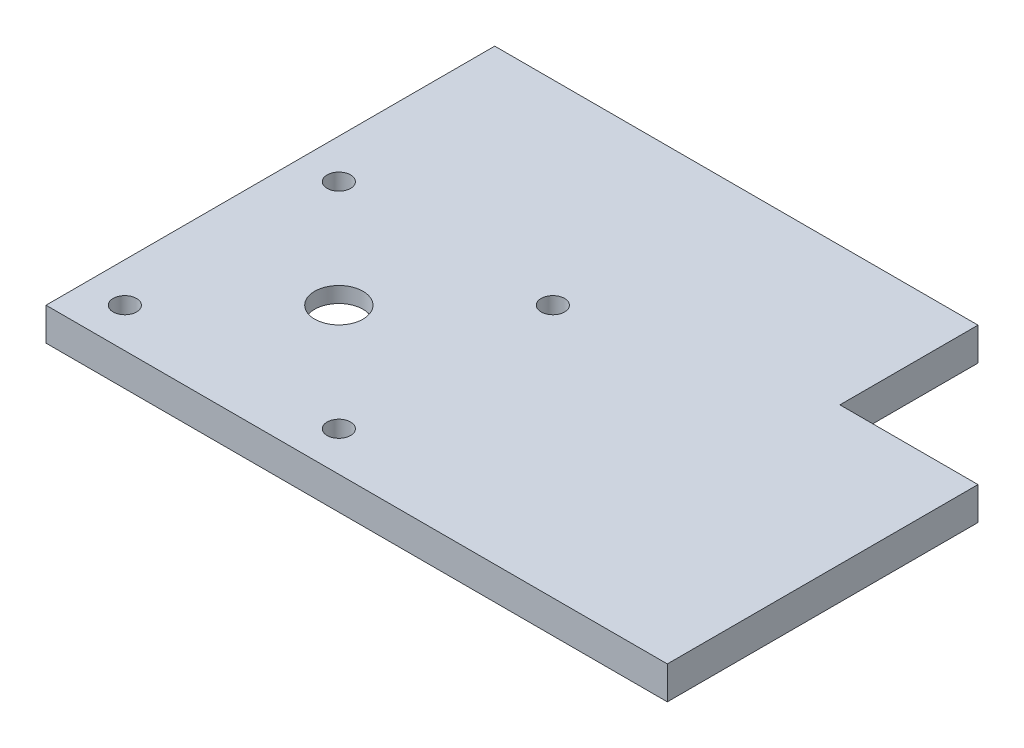
ISO-10303-21;
HEADER;
FILE_DESCRIPTION(('STEP AP214'),'2;1');
FILE_NAME('part.step','',(''),(''),'','','');
FILE_SCHEMA(('AUTOMOTIVE_DESIGN { 1 0 10303 214 1 1 1 1 }'));
ENDSEC;
DATA;
#1=APPLICATION_CONTEXT('core data for automotive mechanical design processes');
#2=APPLICATION_PROTOCOL_DEFINITION('international standard','automotive_design',2000,#1);
#3=PRODUCT_CONTEXT('',#1,'mechanical');
#4=PRODUCT('Part','Part','',(#3));
#5=PRODUCT_RELATED_PRODUCT_CATEGORY('part','',(#4));
#6=PRODUCT_DEFINITION_FORMATION('','',#4);
#7=PRODUCT_DEFINITION_CONTEXT('part definition',#1,'design');
#8=PRODUCT_DEFINITION('design','',#6,#7);
#9=PRODUCT_DEFINITION_SHAPE('','',#8);
#10=(LENGTH_UNIT() NAMED_UNIT(*) SI_UNIT(.MILLI.,.METRE.));
#11=(NAMED_UNIT(*) PLANE_ANGLE_UNIT() SI_UNIT($,.RADIAN.));
#12=(NAMED_UNIT(*) SI_UNIT($,.STERADIAN.) SOLID_ANGLE_UNIT());
#13=UNCERTAINTY_MEASURE_WITH_UNIT(LENGTH_MEASURE(1.E-05),#10,'distance_accuracy_value','');
#14=(GEOMETRIC_REPRESENTATION_CONTEXT(3) GLOBAL_UNCERTAINTY_ASSIGNED_CONTEXT((#13)) GLOBAL_UNIT_ASSIGNED_CONTEXT((#10,
#11,#12)) REPRESENTATION_CONTEXT('',''));
#15=CARTESIAN_POINT('',(0.,0.,0.));
#16=DIRECTION('',(0.,0.,1.));
#17=DIRECTION('',(1.,0.,0.));
#18=AXIS2_PLACEMENT_3D('',#15,#16,#17);
#19=CARTESIAN_POINT('',(21.209,0.,-21.209));
#20=DIRECTION('',(0.,-1.,0.));
#21=DIRECTION('',(0.,0.,-1.));
#22=AXIS2_PLACEMENT_3D('',#19,#20,#21);
#23=CYLINDRICAL_SURFACE('',#22,3.49999999999999);
#24=CARTESIAN_POINT('',(21.209,4.7625,-21.209));
#25=DIRECTION('',(0.,-1.,0.));
#26=DIRECTION('',(0.,0.,-1.));
#27=AXIS2_PLACEMENT_3D('',#24,#25,#26);
#28=CIRCLE('',#27,3.5);
#29=CARTESIAN_POINT('',(21.209,4.7625,-24.709));
#30=VERTEX_POINT('',#29);
#31=EDGE_CURVE('E226',#30,#30,#28,.T.);
#32=ORIENTED_EDGE('',*,*,#31,.F.);
#33=EDGE_LOOP('',(#32));
#34=FACE_BOUND('',#33,.T.);
#35=CARTESIAN_POINT('',(21.209,2.5,-21.209));
#36=DIRECTION('',(0.,-1.,0.));
#37=DIRECTION('',(0.,0.,-1.));
#38=AXIS2_PLACEMENT_3D('',#35,#36,#37);
#39=CIRCLE('',#38,3.49999999999999);
#40=CARTESIAN_POINT('',(21.209,2.5,-24.709));
#41=VERTEX_POINT('',#40);
#42=EDGE_CURVE('E38',#41,#41,#39,.F.);
#43=ORIENTED_EDGE('',*,*,#42,.F.);
#44=EDGE_LOOP('',(#43));
#45=FACE_BOUND('',#44,.T.);
#46=ADVANCED_FACE('F34',(#34,#45),#23,.F.);
#47=CARTESIAN_POINT('',(0.,4.7625,0.));
#48=DIRECTION('',(1.,0.,0.));
#49=DIRECTION('',(0.,0.,-1.));
#50=AXIS2_PLACEMENT_3D('',#47,#48,#49);
#51=PLANE('',#50);
#52=DIRECTION('',(0.,0.,1.));
#53=VECTOR('',#52,1.);
#54=CARTESIAN_POINT('',(0.,0.,0.));
#55=LINE('',#54,#53);
#56=CARTESIAN_POINT('',(0.,0.,-65.));
#57=VERTEX_POINT('',#56);
#58=CARTESIAN_POINT('',(0.,0.,0.));
#59=VERTEX_POINT('',#58);
#60=EDGE_CURVE('E120',#57,#59,#55,.T.);
#61=ORIENTED_EDGE('',*,*,#60,.T.);
#62=DIRECTION('',(0.,-1.,0.));
#63=VECTOR('',#62,1.);
#64=CARTESIAN_POINT('',(0.,4.7625,0.));
#65=LINE('',#64,#63);
#66=CARTESIAN_POINT('',(0.,4.7625,0.));
#67=VERTEX_POINT('',#66);
#68=EDGE_CURVE('E11',#67,#59,#65,.T.);
#69=ORIENTED_EDGE('',*,*,#68,.F.);
#70=DIRECTION('',(0.,0.,1.));
#71=VECTOR('',#70,1.);
#72=CARTESIAN_POINT('',(0.,4.7625,0.));
#73=LINE('',#72,#71);
#74=CARTESIAN_POINT('',(0.,4.7625,-65.));
#75=VERTEX_POINT('',#74);
#76=EDGE_CURVE('E131',#75,#67,#73,.T.);
#77=ORIENTED_EDGE('',*,*,#76,.F.);
#78=DIRECTION('',(0.,-1.,0.));
#79=VECTOR('',#78,1.);
#80=CARTESIAN_POINT('',(0.,4.7625,-65.));
#81=LINE('',#80,#79);
#82=EDGE_CURVE('E116',#75,#57,#81,.T.);
#83=ORIENTED_EDGE('',*,*,#82,.T.);
#84=EDGE_LOOP('',(#61,#69,#77,#83));
#85=FACE_BOUND('',#84,.T.);
#86=ADVANCED_FACE('F36',(#85),#51,.F.);
#87=CARTESIAN_POINT('',(0.,4.7625,0.));
#88=DIRECTION('',(0.,0.,-1.));
#89=DIRECTION('',(-1.,0.,0.));
#90=AXIS2_PLACEMENT_3D('',#87,#88,#89);
#91=PLANE('',#90);
#92=DIRECTION('',(1.,0.,0.));
#93=VECTOR('',#92,1.);
#94=CARTESIAN_POINT('',(0.,0.,0.));
#95=LINE('',#94,#93);
#96=CARTESIAN_POINT('',(90.,0.,0.));
#97=VERTEX_POINT('',#96);
#98=EDGE_CURVE('E123',#59,#97,#95,.T.);
#99=ORIENTED_EDGE('',*,*,#98,.T.);
#100=DIRECTION('',(0.,-1.,0.));
#101=VECTOR('',#100,1.);
#102=CARTESIAN_POINT('',(90.,4.7625,0.));
#103=LINE('',#102,#101);
#104=CARTESIAN_POINT('',(90.,4.7625,0.));
#105=VERTEX_POINT('',#104);
#106=EDGE_CURVE('E44',#105,#97,#103,.T.);
#107=ORIENTED_EDGE('',*,*,#106,.F.);
#108=DIRECTION('',(1.,0.,0.));
#109=VECTOR('',#108,1.);
#110=CARTESIAN_POINT('',(0.,4.7625,0.));
#111=LINE('',#110,#109);
#112=EDGE_CURVE('E89',#67,#105,#111,.T.);
#113=ORIENTED_EDGE('',*,*,#112,.F.);
#114=ORIENTED_EDGE('',*,*,#68,.T.);
#115=EDGE_LOOP('',(#99,#107,#113,#114));
#116=FACE_BOUND('',#115,.T.);
#117=ADVANCED_FACE('F162',(#116),#91,.F.);
#118=CARTESIAN_POINT('',(90.,4.7625,0.));
#119=DIRECTION('',(-1.,0.,0.));
#120=DIRECTION('',(0.,0.,1.));
#121=AXIS2_PLACEMENT_3D('',#118,#119,#120);
#122=PLANE('',#121);
#123=DIRECTION('',(0.,0.,-1.));
#124=VECTOR('',#123,1.);
#125=CARTESIAN_POINT('',(90.,0.,0.));
#126=LINE('',#125,#124);
#127=CARTESIAN_POINT('',(90.,0.,-45.));
#128=VERTEX_POINT('',#127);
#129=EDGE_CURVE('E126',#97,#128,#126,.T.);
#130=ORIENTED_EDGE('',*,*,#129,.T.);
#131=DIRECTION('',(0.,-1.,0.));
#132=VECTOR('',#131,1.);
#133=CARTESIAN_POINT('',(90.,4.7625,-45.));
#134=LINE('',#133,#132);
#135=CARTESIAN_POINT('',(90.,4.7625,-45.));
#136=VERTEX_POINT('',#135);
#137=EDGE_CURVE('E111',#136,#128,#134,.T.);
#138=ORIENTED_EDGE('',*,*,#137,.F.);
#139=DIRECTION('',(0.,0.,-1.));
#140=VECTOR('',#139,1.);
#141=CARTESIAN_POINT('',(90.,4.7625,0.));
#142=LINE('',#141,#140);
#143=EDGE_CURVE('E102',#105,#136,#142,.T.);
#144=ORIENTED_EDGE('',*,*,#143,.F.);
#145=ORIENTED_EDGE('',*,*,#106,.T.);
#146=EDGE_LOOP('',(#130,#138,#144,#145));
#147=FACE_BOUND('',#146,.T.);
#148=ADVANCED_FACE('F138',(#147),#122,.F.);
#149=CARTESIAN_POINT('',(70.,4.7625,-45.));
#150=DIRECTION('',(0.,0.,1.));
#151=DIRECTION('',(1.,0.,0.));
#152=AXIS2_PLACEMENT_3D('',#149,#150,#151);
#153=PLANE('',#152);
#154=DIRECTION('',(-1.,0.,0.));
#155=VECTOR('',#154,1.);
#156=CARTESIAN_POINT('',(70.,0.,-45.));
#157=LINE('',#156,#155);
#158=CARTESIAN_POINT('',(70.,0.,-45.));
#159=VERTEX_POINT('',#158);
#160=EDGE_CURVE('E110',#128,#159,#157,.T.);
#161=ORIENTED_EDGE('',*,*,#160,.T.);
#162=DIRECTION('',(0.,-1.,0.));
#163=VECTOR('',#162,1.);
#164=CARTESIAN_POINT('',(70.,4.7625,-45.));
#165=LINE('',#164,#163);
#166=CARTESIAN_POINT('',(70.,4.7625,-45.));
#167=VERTEX_POINT('',#166);
#168=EDGE_CURVE('E107',#167,#159,#165,.T.);
#169=ORIENTED_EDGE('',*,*,#168,.F.);
#170=DIRECTION('',(-1.,0.,0.));
#171=VECTOR('',#170,1.);
#172=CARTESIAN_POINT('',(70.,4.7625,-45.));
#173=LINE('',#172,#171);
#174=EDGE_CURVE('E96',#136,#167,#173,.T.);
#175=ORIENTED_EDGE('',*,*,#174,.F.);
#176=ORIENTED_EDGE('',*,*,#137,.T.);
#177=EDGE_LOOP('',(#161,#169,#175,#176));
#178=FACE_BOUND('',#177,.T.);
#179=ADVANCED_FACE('F108',(#178),#153,.F.);
#180=CARTESIAN_POINT('',(70.,4.7625,-65.));
#181=DIRECTION('',(-1.,0.,0.));
#182=DIRECTION('',(0.,0.,1.));
#183=AXIS2_PLACEMENT_3D('',#180,#181,#182);
#184=PLANE('',#183);
#185=DIRECTION('',(0.,0.,-1.));
#186=VECTOR('',#185,1.);
#187=CARTESIAN_POINT('',(70.,0.,-65.));
#188=LINE('',#187,#186);
#189=CARTESIAN_POINT('',(70.,0.,-65.));
#190=VERTEX_POINT('',#189);
#191=EDGE_CURVE('E75',#159,#190,#188,.T.);
#192=ORIENTED_EDGE('',*,*,#191,.T.);
#193=DIRECTION('',(0.,-1.,0.));
#194=VECTOR('',#193,1.);
#195=CARTESIAN_POINT('',(70.,4.7625,-65.));
#196=LINE('',#195,#194);
#197=CARTESIAN_POINT('',(70.,4.7625,-65.));
#198=VERTEX_POINT('',#197);
#199=EDGE_CURVE('E112',#198,#190,#196,.T.);
#200=ORIENTED_EDGE('',*,*,#199,.F.);
#201=DIRECTION('',(0.,0.,-1.));
#202=VECTOR('',#201,1.);
#203=CARTESIAN_POINT('',(70.,4.7625,-65.));
#204=LINE('',#203,#202);
#205=EDGE_CURVE('E100',#167,#198,#204,.T.);
#206=ORIENTED_EDGE('',*,*,#205,.F.);
#207=ORIENTED_EDGE('',*,*,#168,.T.);
#208=EDGE_LOOP('',(#192,#200,#206,#207));
#209=FACE_BOUND('',#208,.T.);
#210=ADVANCED_FACE('F114',(#209),#184,.F.);
#211=CARTESIAN_POINT('',(0.,4.7625,-65.));
#212=DIRECTION('',(0.,0.,1.));
#213=DIRECTION('',(1.,0.,0.));
#214=AXIS2_PLACEMENT_3D('',#211,#212,#213);
#215=PLANE('',#214);
#216=DIRECTION('',(-1.,0.,0.));
#217=VECTOR('',#216,1.);
#218=CARTESIAN_POINT('',(0.,0.,-65.));
#219=LINE('',#218,#217);
#220=EDGE_CURVE('E81',#190,#57,#219,.T.);
#221=ORIENTED_EDGE('',*,*,#220,.T.);
#222=ORIENTED_EDGE('',*,*,#82,.F.);
#223=DIRECTION('',(-1.,0.,0.));
#224=VECTOR('',#223,1.);
#225=CARTESIAN_POINT('',(0.,4.7625,-65.));
#226=LINE('',#225,#224);
#227=EDGE_CURVE('E52',#198,#75,#226,.T.);
#228=ORIENTED_EDGE('',*,*,#227,.F.);
#229=ORIENTED_EDGE('',*,*,#199,.T.);
#230=EDGE_LOOP('',(#221,#222,#228,#229));
#231=FACE_BOUND('',#230,.T.);
#232=ADVANCED_FACE('F145',(#231),#215,.F.);
#233=CARTESIAN_POINT('',(0.,4.7625,0.));
#234=DIRECTION('',(0.,-1.,0.));
#235=DIRECTION('',(0.,0.,-1.));
#236=AXIS2_PLACEMENT_3D('',#233,#234,#235);
#237=PLANE('',#236);
#238=ORIENTED_EDGE('',*,*,#31,.T.);
#239=EDGE_LOOP('',(#238));
#240=FACE_BOUND('',#239,.T.);
#241=CARTESIAN_POINT('',(36.709,4.7625,-5.70900000000003));
#242=DIRECTION('',(0.,1.,0.));
#243=DIRECTION('',(0.,0.,1.));
#244=AXIS2_PLACEMENT_3D('',#241,#242,#243);
#245=CIRCLE('',#244,1.7);
#246=CARTESIAN_POINT('',(36.709,4.7625,-4.00900000000003));
#247=VERTEX_POINT('',#246);
#248=EDGE_CURVE('E223',#247,#247,#245,.T.);
#249=ORIENTED_EDGE('',*,*,#248,.F.);
#250=EDGE_LOOP('',(#249));
#251=FACE_BOUND('',#250,.T.);
#252=CARTESIAN_POINT('',(36.709,4.7625,-36.709));
#253=DIRECTION('',(0.,1.,0.));
#254=DIRECTION('',(0.,0.,1.));
#255=AXIS2_PLACEMENT_3D('',#252,#253,#254);
#256=CIRCLE('',#255,1.7);
#257=CARTESIAN_POINT('',(36.709,4.7625,-35.009));
#258=VERTEX_POINT('',#257);
#259=EDGE_CURVE('E219',#258,#258,#256,.T.);
#260=ORIENTED_EDGE('',*,*,#259,.F.);
#261=EDGE_LOOP('',(#260));
#262=FACE_BOUND('',#261,.T.);
#263=CARTESIAN_POINT('',(5.709,4.7625,-36.709));
#264=DIRECTION('',(0.,1.,0.));
#265=DIRECTION('',(0.,0.,1.));
#266=AXIS2_PLACEMENT_3D('',#263,#264,#265);
#267=CIRCLE('',#266,1.7);
#268=CARTESIAN_POINT('',(5.709,4.7625,-35.009));
#269=VERTEX_POINT('',#268);
#270=EDGE_CURVE('E215',#269,#269,#267,.T.);
#271=ORIENTED_EDGE('',*,*,#270,.F.);
#272=EDGE_LOOP('',(#271));
#273=FACE_BOUND('',#272,.T.);
#274=CARTESIAN_POINT('',(5.709,4.7625,-5.70900000000003));
#275=DIRECTION('',(0.,1.,0.));
#276=DIRECTION('',(0.,0.,1.));
#277=AXIS2_PLACEMENT_3D('',#274,#275,#276);
#278=CIRCLE('',#277,1.7);
#279=CARTESIAN_POINT('',(5.709,4.7625,-4.00900000000003));
#280=VERTEX_POINT('',#279);
#281=EDGE_CURVE('E207',#280,#280,#278,.T.);
#282=ORIENTED_EDGE('',*,*,#281,.F.);
#283=EDGE_LOOP('',(#282));
#284=FACE_BOUND('',#283,.T.);
#285=ORIENTED_EDGE('',*,*,#76,.T.);
#286=ORIENTED_EDGE('',*,*,#112,.T.);
#287=ORIENTED_EDGE('',*,*,#143,.T.);
#288=ORIENTED_EDGE('',*,*,#174,.T.);
#289=ORIENTED_EDGE('',*,*,#205,.T.);
#290=ORIENTED_EDGE('',*,*,#227,.T.);
#291=EDGE_LOOP('',(#285,#286,#287,#288,#289,#290));
#292=FACE_BOUND('',#291,.T.);
#293=ADVANCED_FACE('F98',(#240,#251,#262,#273,#284,#292),#237,.F.);
#294=CARTESIAN_POINT('',(0.,0.,0.));
#295=DIRECTION('',(0.,-1.,0.));
#296=DIRECTION('',(0.,0.,-1.));
#297=AXIS2_PLACEMENT_3D('',#294,#295,#296);
#298=PLANE('',#297);
#299=CARTESIAN_POINT('',(21.209,0.,-21.209));
#300=DIRECTION('',(0.,-1.,0.));
#301=DIRECTION('',(0.,0.,-1.));
#302=AXIS2_PLACEMENT_3D('',#299,#300,#301);
#303=CIRCLE('',#302,11.5);
#304=CARTESIAN_POINT('',(21.209,0.,-32.709));
#305=VERTEX_POINT('',#304);
#306=EDGE_CURVE('E192',#305,#305,#303,.T.);
#307=ORIENTED_EDGE('',*,*,#306,.F.);
#308=EDGE_LOOP('',(#307));
#309=FACE_BOUND('',#308,.T.);
#310=CARTESIAN_POINT('',(36.709,0.,-5.70900000000003));
#311=DIRECTION('',(0.,1.,0.));
#312=DIRECTION('',(0.,0.,1.));
#313=AXIS2_PLACEMENT_3D('',#310,#311,#312);
#314=CIRCLE('',#313,1.7);
#315=CARTESIAN_POINT('',(36.709,0.,-4.00900000000003));
#316=VERTEX_POINT('',#315);
#317=EDGE_CURVE('E196',#316,#316,#314,.T.);
#318=ORIENTED_EDGE('',*,*,#317,.T.);
#319=EDGE_LOOP('',(#318));
#320=FACE_BOUND('',#319,.T.);
#321=CARTESIAN_POINT('',(36.709,0.,-36.709));
#322=DIRECTION('',(0.,1.,0.));
#323=DIRECTION('',(0.,0.,1.));
#324=AXIS2_PLACEMENT_3D('',#321,#322,#323);
#325=CIRCLE('',#324,1.7);
#326=CARTESIAN_POINT('',(36.709,0.,-35.009));
#327=VERTEX_POINT('',#326);
#328=EDGE_CURVE('E200',#327,#327,#325,.T.);
#329=ORIENTED_EDGE('',*,*,#328,.T.);
#330=EDGE_LOOP('',(#329));
#331=FACE_BOUND('',#330,.T.);
#332=CARTESIAN_POINT('',(5.709,0.,-36.709));
#333=DIRECTION('',(0.,1.,0.));
#334=DIRECTION('',(0.,0.,1.));
#335=AXIS2_PLACEMENT_3D('',#332,#333,#334);
#336=CIRCLE('',#335,1.7);
#337=CARTESIAN_POINT('',(5.709,0.,-35.009));
#338=VERTEX_POINT('',#337);
#339=EDGE_CURVE('E204',#338,#338,#336,.T.);
#340=ORIENTED_EDGE('',*,*,#339,.T.);
#341=EDGE_LOOP('',(#340));
#342=FACE_BOUND('',#341,.T.);
#343=CARTESIAN_POINT('',(5.709,0.,-5.70900000000003));
#344=DIRECTION('',(0.,1.,0.));
#345=DIRECTION('',(0.,0.,1.));
#346=AXIS2_PLACEMENT_3D('',#343,#344,#345);
#347=CIRCLE('',#346,1.7);
#348=CARTESIAN_POINT('',(5.709,0.,-4.00900000000003));
#349=VERTEX_POINT('',#348);
#350=EDGE_CURVE('E124',#349,#349,#347,.T.);
#351=ORIENTED_EDGE('',*,*,#350,.T.);
#352=EDGE_LOOP('',(#351));
#353=FACE_BOUND('',#352,.T.);
#354=ORIENTED_EDGE('',*,*,#60,.F.);
#355=ORIENTED_EDGE('',*,*,#220,.F.);
#356=ORIENTED_EDGE('',*,*,#191,.F.);
#357=ORIENTED_EDGE('',*,*,#160,.F.);
#358=ORIENTED_EDGE('',*,*,#129,.F.);
#359=ORIENTED_EDGE('',*,*,#98,.F.);
#360=EDGE_LOOP('',(#354,#355,#356,#357,#358,#359));
#361=FACE_BOUND('',#360,.T.);
#362=ADVANCED_FACE('F141',(#309,#320,#331,#342,#353,#361),#298,.T.);
#363=CARTESIAN_POINT('',(5.709,4.7625,-5.70900000000003));
#364=DIRECTION('',(0.,1.,0.));
#365=DIRECTION('',(0.,0.,1.));
#366=AXIS2_PLACEMENT_3D('',#363,#364,#365);
#367=CYLINDRICAL_SURFACE('',#366,1.7);
#368=ORIENTED_EDGE('',*,*,#350,.F.);
#369=EDGE_LOOP('',(#368));
#370=FACE_BOUND('',#369,.T.);
#371=ORIENTED_EDGE('',*,*,#281,.T.);
#372=EDGE_LOOP('',(#371));
#373=FACE_BOUND('',#372,.T.);
#374=ADVANCED_FACE('F181',(#370,#373),#367,.F.);
#375=CARTESIAN_POINT('',(5.709,4.7625,-36.709));
#376=DIRECTION('',(0.,1.,0.));
#377=DIRECTION('',(0.,0.,1.));
#378=AXIS2_PLACEMENT_3D('',#375,#376,#377);
#379=CYLINDRICAL_SURFACE('',#378,1.7);
#380=ORIENTED_EDGE('',*,*,#339,.F.);
#381=EDGE_LOOP('',(#380));
#382=FACE_BOUND('',#381,.T.);
#383=ORIENTED_EDGE('',*,*,#270,.T.);
#384=EDGE_LOOP('',(#383));
#385=FACE_BOUND('',#384,.T.);
#386=ADVANCED_FACE('F177',(#382,#385),#379,.F.);
#387=CARTESIAN_POINT('',(36.709,4.7625,-36.709));
#388=DIRECTION('',(0.,1.,0.));
#389=DIRECTION('',(0.,0.,1.));
#390=AXIS2_PLACEMENT_3D('',#387,#388,#389);
#391=CYLINDRICAL_SURFACE('',#390,1.7);
#392=ORIENTED_EDGE('',*,*,#328,.F.);
#393=EDGE_LOOP('',(#392));
#394=FACE_BOUND('',#393,.T.);
#395=ORIENTED_EDGE('',*,*,#259,.T.);
#396=EDGE_LOOP('',(#395));
#397=FACE_BOUND('',#396,.T.);
#398=ADVANCED_FACE('F173',(#394,#397),#391,.F.);
#399=CARTESIAN_POINT('',(36.709,4.7625,-5.70900000000003));
#400=DIRECTION('',(0.,1.,0.));
#401=DIRECTION('',(0.,0.,1.));
#402=AXIS2_PLACEMENT_3D('',#399,#400,#401);
#403=CYLINDRICAL_SURFACE('',#402,1.7);
#404=ORIENTED_EDGE('',*,*,#317,.F.);
#405=EDGE_LOOP('',(#404));
#406=FACE_BOUND('',#405,.T.);
#407=ORIENTED_EDGE('',*,*,#248,.T.);
#408=EDGE_LOOP('',(#407));
#409=FACE_BOUND('',#408,.T.);
#410=ADVANCED_FACE('F169',(#406,#409),#403,.F.);
#411=CARTESIAN_POINT('',(21.209,2.5,-21.209));
#412=DIRECTION('',(0.,-1.,0.));
#413=DIRECTION('',(0.,0.,-1.));
#414=AXIS2_PLACEMENT_3D('',#411,#412,#413);
#415=PLANE('',#414);
#416=CARTESIAN_POINT('',(21.209,2.5,-21.209));
#417=DIRECTION('',(0.,-1.,0.));
#418=DIRECTION('',(0.,0.,-1.));
#419=AXIS2_PLACEMENT_3D('',#416,#417,#418);
#420=CIRCLE('',#419,11.5);
#421=CARTESIAN_POINT('',(21.209,2.5,-32.709));
#422=VERTEX_POINT('',#421);
#423=EDGE_CURVE('E230',#422,#422,#420,.T.);
#424=ORIENTED_EDGE('',*,*,#423,.T.);
#425=EDGE_LOOP('',(#424));
#426=FACE_BOUND('',#425,.T.);
#427=ORIENTED_EDGE('',*,*,#42,.T.);
#428=EDGE_LOOP('',(#427));
#429=FACE_BOUND('',#428,.T.);
#430=ADVANCED_FACE('F172',(#426,#429),#415,.T.);
#431=CARTESIAN_POINT('',(21.209,2.5,-21.209));
#432=DIRECTION('',(0.,-1.,0.));
#433=DIRECTION('',(0.,0.,-1.));
#434=AXIS2_PLACEMENT_3D('',#431,#432,#433);
#435=CYLINDRICAL_SURFACE('',#434,11.5);
#436=ORIENTED_EDGE('',*,*,#423,.F.);
#437=EDGE_LOOP('',(#436));
#438=FACE_BOUND('',#437,.T.);
#439=ORIENTED_EDGE('',*,*,#306,.T.);
#440=EDGE_LOOP('',(#439));
#441=FACE_BOUND('',#440,.T.);
#442=ADVANCED_FACE('F167',(#438,#441),#435,.F.);
#443=CLOSED_SHELL('',(#46,#86,#117,#148,#179,#210,#232,#293,#362,#374,#386,#398,#410,#430,#442));
#444=MANIFOLD_SOLID_BREP('B2',#443);
#445=ADVANCED_BREP_SHAPE_REPRESENTATION('',(#18,#444),#14);
#446=SHAPE_DEFINITION_REPRESENTATION(#9,#445);
ENDSEC;
END-ISO-10303-21;
